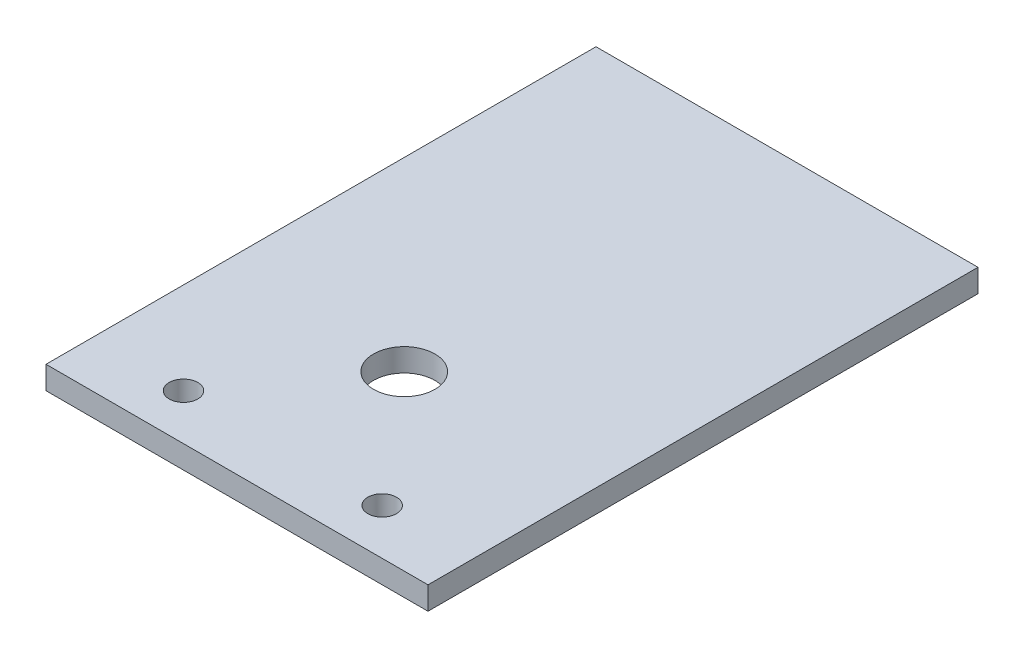
ISO-10303-21;
HEADER;
FILE_DESCRIPTION(('STEP AP214'),'2;1');
FILE_NAME('part.step','',(''),(''),'','','');
FILE_SCHEMA(('AUTOMOTIVE_DESIGN { 1 0 10303 214 1 1 1 1 }'));
ENDSEC;
DATA;
#1=APPLICATION_CONTEXT('core data for automotive mechanical design processes');
#2=APPLICATION_PROTOCOL_DEFINITION('international standard','automotive_design',2000,#1);
#3=PRODUCT_CONTEXT('',#1,'mechanical');
#4=PRODUCT('Part','Part','',(#3));
#5=PRODUCT_RELATED_PRODUCT_CATEGORY('part','',(#4));
#6=PRODUCT_DEFINITION_FORMATION('','',#4);
#7=PRODUCT_DEFINITION_CONTEXT('part definition',#1,'design');
#8=PRODUCT_DEFINITION('design','',#6,#7);
#9=PRODUCT_DEFINITION_SHAPE('','',#8);
#10=(LENGTH_UNIT() NAMED_UNIT(*) SI_UNIT(.MILLI.,.METRE.));
#11=(NAMED_UNIT(*) PLANE_ANGLE_UNIT() SI_UNIT($,.RADIAN.));
#12=(NAMED_UNIT(*) SI_UNIT($,.STERADIAN.) SOLID_ANGLE_UNIT());
#13=UNCERTAINTY_MEASURE_WITH_UNIT(LENGTH_MEASURE(1.E-05),#10,'distance_accuracy_value','');
#14=(GEOMETRIC_REPRESENTATION_CONTEXT(3) GLOBAL_UNCERTAINTY_ASSIGNED_CONTEXT((#13)) GLOBAL_UNIT_ASSIGNED_CONTEXT((#10,
#11,#12)) REPRESENTATION_CONTEXT('',''));
#15=CARTESIAN_POINT('',(0.,0.,0.));
#16=DIRECTION('',(0.,0.,1.));
#17=DIRECTION('',(1.,0.,0.));
#18=AXIS2_PLACEMENT_3D('',#15,#16,#17);
#19=CARTESIAN_POINT('',(52.924999949,6.35,-76.2));
#20=DIRECTION('',(-1.,0.,0.));
#21=DIRECTION('',(0.,0.,1.));
#22=AXIS2_PLACEMENT_3D('',#19,#20,#21);
#23=PLANE('',#22);
#24=DIRECTION('',(0.,0.,-1.));
#25=VECTOR('',#24,1.);
#26=CARTESIAN_POINT('',(52.924999949,0.,-76.2));
#27=LINE('',#26,#25);
#28=CARTESIAN_POINT('',(52.924999949,0.,76.2));
#29=VERTEX_POINT('',#28);
#30=CARTESIAN_POINT('',(52.924999949,0.,-76.2));
#31=VERTEX_POINT('',#30);
#32=EDGE_CURVE('E96',#29,#31,#27,.T.);
#33=ORIENTED_EDGE('',*,*,#32,.T.);
#34=DIRECTION('',(0.,-1.,0.));
#35=VECTOR('',#34,1.);
#36=CARTESIAN_POINT('',(52.924999949,6.35,-76.2));
#37=LINE('',#36,#35);
#38=CARTESIAN_POINT('',(52.924999949,6.35,-76.2));
#39=VERTEX_POINT('',#38);
#40=EDGE_CURVE('E11',#39,#31,#37,.T.);
#41=ORIENTED_EDGE('',*,*,#40,.F.);
#42=DIRECTION('',(0.,0.,-1.));
#43=VECTOR('',#42,1.);
#44=CARTESIAN_POINT('',(52.924999949,6.35,-76.2));
#45=LINE('',#44,#43);
#46=CARTESIAN_POINT('',(52.924999949,6.35,76.2));
#47=VERTEX_POINT('',#46);
#48=EDGE_CURVE('E84',#47,#39,#45,.T.);
#49=ORIENTED_EDGE('',*,*,#48,.F.);
#50=DIRECTION('',(0.,-1.,0.));
#51=VECTOR('',#50,1.);
#52=CARTESIAN_POINT('',(52.924999949,6.35,76.2));
#53=LINE('',#52,#51);
#54=EDGE_CURVE('E92',#47,#29,#53,.T.);
#55=ORIENTED_EDGE('',*,*,#54,.T.);
#56=EDGE_LOOP('',(#33,#41,#49,#55));
#57=FACE_BOUND('',#56,.T.);
#58=ADVANCED_FACE('F33',(#57),#23,.F.);
#59=CARTESIAN_POINT('',(-52.924999949,6.35,-76.2));
#60=DIRECTION('',(0.,0.,1.));
#61=DIRECTION('',(1.,0.,0.));
#62=AXIS2_PLACEMENT_3D('',#59,#60,#61);
#63=PLANE('',#62);
#64=DIRECTION('',(-1.,0.,0.));
#65=VECTOR('',#64,1.);
#66=CARTESIAN_POINT('',(-52.924999949,0.,-76.2));
#67=LINE('',#66,#65);
#68=CARTESIAN_POINT('',(-52.924999949,0.,-76.2));
#69=VERTEX_POINT('',#68);
#70=EDGE_CURVE('E88',#31,#69,#67,.T.);
#71=ORIENTED_EDGE('',*,*,#70,.T.);
#72=DIRECTION('',(0.,-1.,0.));
#73=VECTOR('',#72,1.);
#74=CARTESIAN_POINT('',(-52.924999949,6.35,-76.2));
#75=LINE('',#74,#73);
#76=CARTESIAN_POINT('',(-52.924999949,6.35,-76.2));
#77=VERTEX_POINT('',#76);
#78=EDGE_CURVE('E41',#77,#69,#75,.T.);
#79=ORIENTED_EDGE('',*,*,#78,.F.);
#80=DIRECTION('',(-1.,0.,0.));
#81=VECTOR('',#80,1.);
#82=CARTESIAN_POINT('',(-52.924999949,6.35,-76.2));
#83=LINE('',#82,#81);
#84=EDGE_CURVE('E79',#39,#77,#83,.T.);
#85=ORIENTED_EDGE('',*,*,#84,.F.);
#86=ORIENTED_EDGE('',*,*,#40,.T.);
#87=EDGE_LOOP('',(#71,#79,#85,#86));
#88=FACE_BOUND('',#87,.T.);
#89=ADVANCED_FACE('F87',(#88),#63,.F.);
#90=CARTESIAN_POINT('',(-52.924999949,6.35,-76.2));
#91=DIRECTION('',(1.,0.,0.));
#92=DIRECTION('',(0.,0.,-1.));
#93=AXIS2_PLACEMENT_3D('',#90,#91,#92);
#94=PLANE('',#93);
#95=DIRECTION('',(0.,0.,1.));
#96=VECTOR('',#95,1.);
#97=CARTESIAN_POINT('',(-52.924999949,0.,-76.2));
#98=LINE('',#97,#96);
#99=CARTESIAN_POINT('',(-52.924999949,0.,76.2));
#100=VERTEX_POINT('',#99);
#101=EDGE_CURVE('E66',#69,#100,#98,.T.);
#102=ORIENTED_EDGE('',*,*,#101,.T.);
#103=DIRECTION('',(0.,-1.,0.));
#104=VECTOR('',#103,1.);
#105=CARTESIAN_POINT('',(-52.924999949,6.35,76.2));
#106=LINE('',#105,#104);
#107=CARTESIAN_POINT('',(-52.924999949,6.35,76.2));
#108=VERTEX_POINT('',#107);
#109=EDGE_CURVE('E89',#108,#100,#106,.T.);
#110=ORIENTED_EDGE('',*,*,#109,.F.);
#111=DIRECTION('',(0.,0.,1.));
#112=VECTOR('',#111,1.);
#113=CARTESIAN_POINT('',(-52.924999949,6.35,-76.2));
#114=LINE('',#113,#112);
#115=EDGE_CURVE('E82',#77,#108,#114,.T.);
#116=ORIENTED_EDGE('',*,*,#115,.F.);
#117=ORIENTED_EDGE('',*,*,#78,.T.);
#118=EDGE_LOOP('',(#102,#110,#116,#117));
#119=FACE_BOUND('',#118,.T.);
#120=ADVANCED_FACE('F90',(#119),#94,.F.);
#121=CARTESIAN_POINT('',(-52.924999949,6.35,76.2));
#122=DIRECTION('',(0.,0.,-1.));
#123=DIRECTION('',(-1.,0.,0.));
#124=AXIS2_PLACEMENT_3D('',#121,#122,#123);
#125=PLANE('',#124);
#126=DIRECTION('',(1.,0.,0.));
#127=VECTOR('',#126,1.);
#128=CARTESIAN_POINT('',(-52.924999949,0.,76.2));
#129=LINE('',#128,#127);
#130=EDGE_CURVE('E72',#100,#29,#129,.T.);
#131=ORIENTED_EDGE('',*,*,#130,.T.);
#132=ORIENTED_EDGE('',*,*,#54,.F.);
#133=DIRECTION('',(1.,0.,0.));
#134=VECTOR('',#133,1.);
#135=CARTESIAN_POINT('',(-52.924999949,6.35,76.2));
#136=LINE('',#135,#134);
#137=EDGE_CURVE('E49',#108,#47,#136,.T.);
#138=ORIENTED_EDGE('',*,*,#137,.F.);
#139=ORIENTED_EDGE('',*,*,#109,.T.);
#140=EDGE_LOOP('',(#131,#132,#138,#139));
#141=FACE_BOUND('',#140,.T.);
#142=ADVANCED_FACE('F104',(#141),#125,.F.);
#143=CARTESIAN_POINT('',(0.,6.35,0.));
#144=DIRECTION('',(0.,1.,0.));
#145=DIRECTION('',(0.,0.,1.));
#146=AXIS2_PLACEMENT_3D('',#143,#144,#145);
#147=PLANE('',#146);
#148=CARTESIAN_POINT('',(-1.52399988100002,6.35,28.34));
#149=DIRECTION('',(0.,1.,0.));
#150=DIRECTION('',(0.,0.,1.));
#151=AXIS2_PLACEMENT_3D('',#148,#149,#150);
#152=CIRCLE('',#151,8.5);
#153=CARTESIAN_POINT('',(-1.52399988100002,6.35,36.84));
#154=VERTEX_POINT('',#153);
#155=EDGE_CURVE('E124',#154,#154,#152,.T.);
#156=ORIENTED_EDGE('',*,*,#155,.F.);
#157=EDGE_LOOP('',(#156));
#158=FACE_BOUND('',#157,.T.);
#159=CARTESIAN_POINT('',(27.524999949,6.35,63.5));
#160=DIRECTION('',(0.,1.,0.));
#161=DIRECTION('',(0.,0.,-1.));
#162=AXIS2_PLACEMENT_3D('',#159,#160,#161);
#163=CIRCLE('',#162,3.96875000000011);
#164=CARTESIAN_POINT('',(27.524999949,6.35,59.5312499999999));
#165=VERTEX_POINT('',#164);
#166=EDGE_CURVE('E118',#165,#165,#163,.T.);
#167=ORIENTED_EDGE('',*,*,#166,.F.);
#168=EDGE_LOOP('',(#167));
#169=FACE_BOUND('',#168,.T.);
#170=CARTESIAN_POINT('',(-27.524999949,6.35,63.5));
#171=DIRECTION('',(0.,1.,0.));
#172=DIRECTION('',(0.,0.,1.));
#173=AXIS2_PLACEMENT_3D('',#170,#171,#172);
#174=CIRCLE('',#173,3.96875000000011);
#175=CARTESIAN_POINT('',(-27.524999949,6.35,67.4687500000001));
#176=VERTEX_POINT('',#175);
#177=EDGE_CURVE('E112',#176,#176,#174,.T.);
#178=ORIENTED_EDGE('',*,*,#177,.F.);
#179=EDGE_LOOP('',(#178));
#180=FACE_BOUND('',#179,.T.);
#181=ORIENTED_EDGE('',*,*,#48,.T.);
#182=ORIENTED_EDGE('',*,*,#84,.T.);
#183=ORIENTED_EDGE('',*,*,#115,.T.);
#184=ORIENTED_EDGE('',*,*,#137,.T.);
#185=EDGE_LOOP('',(#181,#182,#183,#184));
#186=FACE_BOUND('',#185,.T.);
#187=ADVANCED_FACE('F80',(#158,#169,#180,#186),#147,.T.);
#188=CARTESIAN_POINT('',(0.,0.,0.));
#189=DIRECTION('',(0.,1.,0.));
#190=DIRECTION('',(0.,0.,1.));
#191=AXIS2_PLACEMENT_3D('',#188,#189,#190);
#192=PLANE('',#191);
#193=CARTESIAN_POINT('',(-1.52399988100002,0.,28.34));
#194=DIRECTION('',(0.,1.,0.));
#195=DIRECTION('',(0.,0.,1.));
#196=AXIS2_PLACEMENT_3D('',#193,#194,#195);
#197=CIRCLE('',#196,8.5);
#198=CARTESIAN_POINT('',(-1.52399988100002,0.,36.84));
#199=VERTEX_POINT('',#198);
#200=EDGE_CURVE('E121',#199,#199,#197,.F.);
#201=ORIENTED_EDGE('',*,*,#200,.F.);
#202=EDGE_LOOP('',(#201));
#203=FACE_BOUND('',#202,.T.);
#204=CARTESIAN_POINT('',(27.524999949,0.,63.5));
#205=DIRECTION('',(0.,1.,0.));
#206=DIRECTION('',(0.,0.,1.));
#207=AXIS2_PLACEMENT_3D('',#204,#205,#206);
#208=CIRCLE('',#207,3.96875000000011);
#209=CARTESIAN_POINT('',(27.524999949,0.,67.4687500000001));
#210=VERTEX_POINT('',#209);
#211=EDGE_CURVE('E115',#210,#210,#208,.F.);
#212=ORIENTED_EDGE('',*,*,#211,.F.);
#213=EDGE_LOOP('',(#212));
#214=FACE_BOUND('',#213,.T.);
#215=CARTESIAN_POINT('',(-27.524999949,0.,63.5));
#216=DIRECTION('',(0.,1.,0.));
#217=DIRECTION('',(0.,0.,1.));
#218=AXIS2_PLACEMENT_3D('',#215,#216,#217);
#219=CIRCLE('',#218,3.96875000000011);
#220=CARTESIAN_POINT('',(-27.524999949,0.,67.4687500000001));
#221=VERTEX_POINT('',#220);
#222=EDGE_CURVE('E99',#221,#221,#219,.F.);
#223=ORIENTED_EDGE('',*,*,#222,.F.);
#224=EDGE_LOOP('',(#223));
#225=FACE_BOUND('',#224,.T.);
#226=ORIENTED_EDGE('',*,*,#32,.F.);
#227=ORIENTED_EDGE('',*,*,#130,.F.);
#228=ORIENTED_EDGE('',*,*,#101,.F.);
#229=ORIENTED_EDGE('',*,*,#70,.F.);
#230=EDGE_LOOP('',(#226,#227,#228,#229));
#231=FACE_BOUND('',#230,.T.);
#232=ADVANCED_FACE('F107',(#203,#214,#225,#231),#192,.F.);
#233=CARTESIAN_POINT('',(-27.524999949,-0.00100000000000013,63.5));
#234=DIRECTION('',(0.,1.,0.));
#235=DIRECTION('',(0.,0.,1.));
#236=AXIS2_PLACEMENT_3D('',#233,#234,#235);
#237=CYLINDRICAL_SURFACE('',#236,3.96875000000011);
#238=ORIENTED_EDGE('',*,*,#177,.T.);
#239=EDGE_LOOP('',(#238));
#240=FACE_BOUND('',#239,.T.);
#241=ORIENTED_EDGE('',*,*,#222,.T.);
#242=EDGE_LOOP('',(#241));
#243=FACE_BOUND('',#242,.T.);
#244=ADVANCED_FACE('F138',(#240,#243),#237,.F.);
#245=CARTESIAN_POINT('',(27.524999949,-0.00100000000000013,63.5));
#246=DIRECTION('',(0.,1.,0.));
#247=DIRECTION('',(0.,0.,1.));
#248=AXIS2_PLACEMENT_3D('',#245,#246,#247);
#249=CYLINDRICAL_SURFACE('',#248,3.96875000000011);
#250=ORIENTED_EDGE('',*,*,#166,.T.);
#251=EDGE_LOOP('',(#250));
#252=FACE_BOUND('',#251,.T.);
#253=ORIENTED_EDGE('',*,*,#211,.T.);
#254=EDGE_LOOP('',(#253));
#255=FACE_BOUND('',#254,.T.);
#256=ADVANCED_FACE('F141',(#252,#255),#249,.F.);
#257=CARTESIAN_POINT('',(-1.52399988100002,-0.00100000000000013,28.34));
#258=DIRECTION('',(0.,1.,0.));
#259=DIRECTION('',(0.,0.,1.));
#260=AXIS2_PLACEMENT_3D('',#257,#258,#259);
#261=CYLINDRICAL_SURFACE('',#260,8.5);
#262=ORIENTED_EDGE('',*,*,#155,.T.);
#263=EDGE_LOOP('',(#262));
#264=FACE_BOUND('',#263,.T.);
#265=ORIENTED_EDGE('',*,*,#200,.T.);
#266=EDGE_LOOP('',(#265));
#267=FACE_BOUND('',#266,.T.);
#268=ADVANCED_FACE('F128',(#264,#267),#261,.F.);
#269=CLOSED_SHELL('',(#58,#89,#120,#142,#187,#232,#244,#256,#268));
#270=MANIFOLD_SOLID_BREP('B2',#269);
#271=ADVANCED_BREP_SHAPE_REPRESENTATION('',(#18,#270),#14);
#272=SHAPE_DEFINITION_REPRESENTATION(#9,#271);
ENDSEC;
END-ISO-10303-21;
